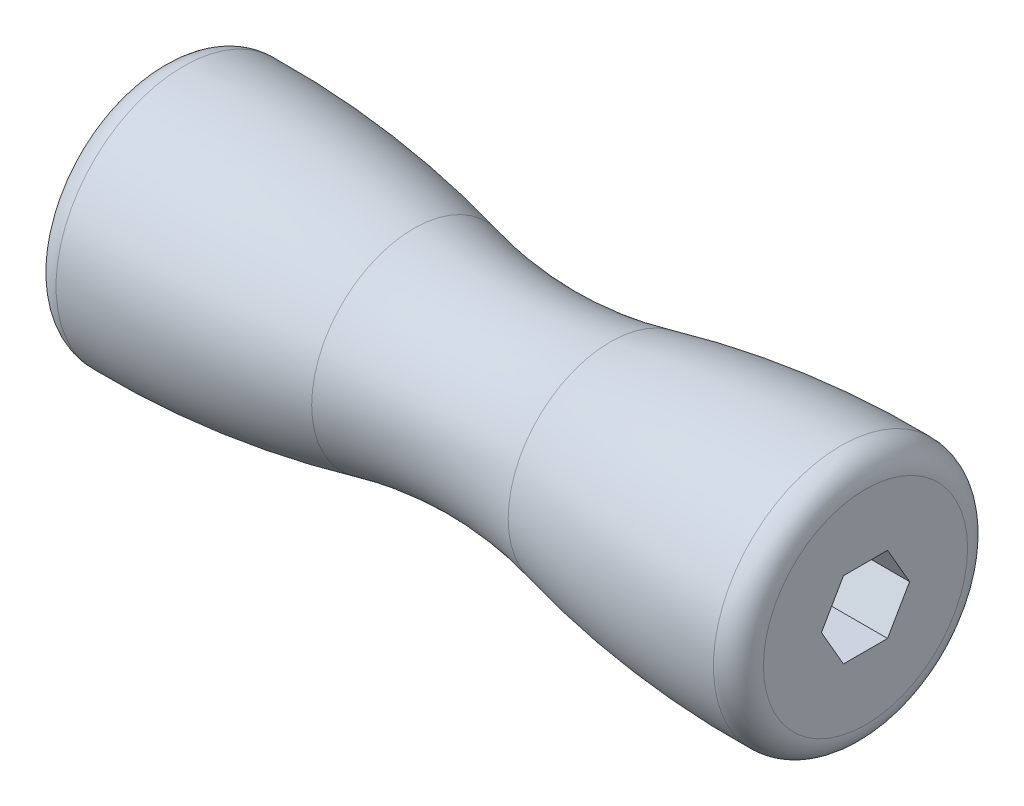
ISO-10303-21;
HEADER;
FILE_DESCRIPTION(('STEP AP214'),'2;1');
FILE_NAME('part.step','',(''),(''),'','','');
FILE_SCHEMA(('AUTOMOTIVE_DESIGN { 1 0 10303 214 1 1 1 1 }'));
ENDSEC;
DATA;
#1=APPLICATION_CONTEXT('core data for automotive mechanical design processes');
#2=APPLICATION_PROTOCOL_DEFINITION('international standard','automotive_design',2000,#1);
#3=PRODUCT_CONTEXT('',#1,'mechanical');
#4=PRODUCT('Part','Part','',(#3));
#5=PRODUCT_RELATED_PRODUCT_CATEGORY('part','',(#4));
#6=PRODUCT_DEFINITION_FORMATION('','',#4);
#7=PRODUCT_DEFINITION_CONTEXT('part definition',#1,'design');
#8=PRODUCT_DEFINITION('design','',#6,#7);
#9=PRODUCT_DEFINITION_SHAPE('','',#8);
#10=(LENGTH_UNIT() NAMED_UNIT(*) SI_UNIT(.MILLI.,.METRE.));
#11=(NAMED_UNIT(*) PLANE_ANGLE_UNIT() SI_UNIT($,.RADIAN.));
#12=(NAMED_UNIT(*) SI_UNIT($,.STERADIAN.) SOLID_ANGLE_UNIT());
#13=UNCERTAINTY_MEASURE_WITH_UNIT(LENGTH_MEASURE(1.E-05),#10,'distance_accuracy_value','');
#14=(GEOMETRIC_REPRESENTATION_CONTEXT(3) GLOBAL_UNCERTAINTY_ASSIGNED_CONTEXT((#13)) GLOBAL_UNIT_ASSIGNED_CONTEXT((#10,
#11,#12)) REPRESENTATION_CONTEXT('',''));
#15=CARTESIAN_POINT('',(0.,0.,0.));
#16=DIRECTION('',(0.,0.,1.));
#17=DIRECTION('',(1.,0.,0.));
#18=AXIS2_PLACEMENT_3D('',#15,#16,#17);
#19=CARTESIAN_POINT('',(-25.,0.,0.));
#20=DIRECTION('',(-1.,0.,0.));
#21=DIRECTION('',(0.,-1.,0.));
#22=AXIS2_PLACEMENT_3D('',#19,#20,#21);
#23=PLANE('',#22);
#24=DIRECTION('',(0.,0.866025403784439,-0.5));
#25=VECTOR('',#24,1.);
#26=CARTESIAN_POINT('',(-25.,-2.7,-1.55884572681199));
#27=LINE('',#26,#25);
#28=CARTESIAN_POINT('',(-25.,-2.7,-1.55884572681199));
#29=VERTEX_POINT('',#28);
#30=CARTESIAN_POINT('',(-25.,0.,-3.11769145362398));
#31=VERTEX_POINT('',#30);
#32=EDGE_CURVE('E91',#29,#31,#27,.T.);
#33=ORIENTED_EDGE('',*,*,#32,.T.);
#34=DIRECTION('',(0.,0.866025403784439,0.5));
#35=VECTOR('',#34,1.);
#36=CARTESIAN_POINT('',(-25.,0.,-3.11769145362398));
#37=LINE('',#36,#35);
#38=CARTESIAN_POINT('',(-25.,2.7,-1.55884572681199));
#39=VERTEX_POINT('',#38);
#40=EDGE_CURVE('E100',#31,#39,#37,.T.);
#41=ORIENTED_EDGE('',*,*,#40,.T.);
#42=DIRECTION('',(0.,0.,1.));
#43=VECTOR('',#42,1.);
#44=CARTESIAN_POINT('',(-25.,2.7,-1.55884572681199));
#45=LINE('',#44,#43);
#46=CARTESIAN_POINT('',(-25.,2.7,1.55884572681199));
#47=VERTEX_POINT('',#46);
#48=EDGE_CURVE('E51',#39,#47,#45,.T.);
#49=ORIENTED_EDGE('',*,*,#48,.T.);
#50=DIRECTION('',(0.,-0.866025403784439,0.5));
#51=VECTOR('',#50,1.);
#52=CARTESIAN_POINT('',(-25.,2.7,1.55884572681199));
#53=LINE('',#52,#51);
#54=CARTESIAN_POINT('',(-25.,0.,3.11769145362398));
#55=VERTEX_POINT('',#54);
#56=EDGE_CURVE('E114',#47,#55,#53,.T.);
#57=ORIENTED_EDGE('',*,*,#56,.T.);
#58=DIRECTION('',(0.,-0.866025403784438,-0.5));
#59=VECTOR('',#58,1.);
#60=CARTESIAN_POINT('',(-25.,0.,3.11769145362398));
#61=LINE('',#60,#59);
#62=CARTESIAN_POINT('',(-25.,-2.7,1.55884572681199));
#63=VERTEX_POINT('',#62);
#64=EDGE_CURVE('E117',#55,#63,#61,.T.);
#65=ORIENTED_EDGE('',*,*,#64,.T.);
#66=DIRECTION('',(0.,0.,-1.));
#67=VECTOR('',#66,1.);
#68=CARTESIAN_POINT('',(-25.,-2.7,1.55884572681199));
#69=LINE('',#68,#67);
#70=EDGE_CURVE('E97',#63,#29,#69,.T.);
#71=ORIENTED_EDGE('',*,*,#70,.T.);
#72=EDGE_LOOP('',(#33,#41,#49,#57,#65,#71));
#73=FACE_BOUND('',#72,.T.);
#74=CARTESIAN_POINT('',(-25.,0.,0.));
#75=DIRECTION('',(1.,0.,0.));
#76=DIRECTION('',(0.,1.,0.));
#77=AXIS2_PLACEMENT_3D('',#74,#75,#76);
#78=CIRCLE('',#77,7.21812745520262);
#79=CARTESIAN_POINT('',(-25.,7.21812745520262,0.));
#80=VERTEX_POINT('',#79);
#81=EDGE_CURVE('E11',#80,#80,#78,.T.);
#82=ORIENTED_EDGE('',*,*,#81,.F.);
#83=EDGE_LOOP('',(#82));
#84=FACE_BOUND('',#83,.T.);
#85=ADVANCED_FACE('F37',(#73,#84),#23,.T.);
#86=CARTESIAN_POINT('',(-23.217947805922,0.,0.));
#87=DIRECTION('',(1.,0.,0.));
#88=DIRECTION('',(0.,1.,0.));
#89=AXIS2_PLACEMENT_3D('',#86,#87,#88);
#90=TOROIDAL_SURFACE('',#89,7.21812745520262,1.782052194078);
#91=ORIENTED_EDGE('',*,*,#81,.T.);
#92=EDGE_LOOP('',(#91));
#93=FACE_BOUND('',#92,.T.);
#94=CARTESIAN_POINT('',(-23.2432510965285,0.,0.));
#95=DIRECTION('',(1.,0.,0.));
#96=DIRECTION('',(0.,1.,0.));
#97=AXIS2_PLACEMENT_3D('',#94,#95,#96);
#98=CIRCLE('',#97,9.);
#99=CARTESIAN_POINT('',(-23.2432510965285,9.,0.));
#100=VERTEX_POINT('',#99);
#101=EDGE_CURVE('E44',#100,#100,#98,.T.);
#102=ORIENTED_EDGE('',*,*,#101,.F.);
#103=EDGE_LOOP('',(#102));
#104=FACE_BOUND('',#103,.T.);
#105=ADVANCED_FACE('F157',(#93,#104),#90,.T.);
#106=CARTESIAN_POINT('',(-22.2956280625294,0.,0.));
#107=DIRECTION('',(1.,0.,0.));
#108=DIRECTION('',(0.,1.,0.));
#109=AXIS2_PLACEMENT_3D('',#106,#107,#108);
#110=DEGENERATE_TOROIDAL_SURFACE('',#109,57.7321690826381,66.7388970532805,.F.);
#111=ORIENTED_EDGE('',*,*,#101,.T.);
#112=EDGE_LOOP('',(#111));
#113=FACE_BOUND('',#112,.T.);
#114=CARTESIAN_POINT('',(-6.94833645993958,0.,0.));
#115=DIRECTION('',(1.,0.,0.));
#116=DIRECTION('',(0.,1.,0.));
#117=AXIS2_PLACEMENT_3D('',#114,#115,#116);
#118=CIRCLE('',#117,7.21812745520262);
#119=CARTESIAN_POINT('',(-6.94833645993958,7.21812745520262,0.));
#120=VERTEX_POINT('',#119);
#121=EDGE_CURVE('E149',#120,#120,#118,.T.);
#122=ORIENTED_EDGE('',*,*,#121,.F.);
#123=EDGE_LOOP('',(#122));
#124=FACE_BOUND('',#123,.T.);
#125=ADVANCED_FACE('F154',(#113,#124),#110,.F.);
#126=CARTESIAN_POINT('',(0.,0.,0.));
#127=DIRECTION('',(1.,0.,0.));
#128=DIRECTION('',(0.,1.,0.));
#129=AXIS2_PLACEMENT_3D('',#126,#127,#128);
#130=TOROIDAL_SURFACE('',#129,36.6237401980803,30.2153841667555);
#131=ORIENTED_EDGE('',*,*,#121,.T.);
#132=EDGE_LOOP('',(#131));
#133=FACE_BOUND('',#132,.T.);
#134=CARTESIAN_POINT('',(6.94833645993956,0.,0.));
#135=DIRECTION('',(1.,0.,0.));
#136=DIRECTION('',(0.,1.,0.));
#137=AXIS2_PLACEMENT_3D('',#134,#135,#136);
#138=CIRCLE('',#137,7.21812745520262);
#139=CARTESIAN_POINT('',(6.94833645993956,7.21812745520262,0.));
#140=VERTEX_POINT('',#139);
#141=EDGE_CURVE('E146',#140,#140,#138,.T.);
#142=ORIENTED_EDGE('',*,*,#141,.F.);
#143=EDGE_LOOP('',(#142));
#144=FACE_BOUND('',#143,.T.);
#145=ADVANCED_FACE('F164',(#133,#144),#130,.F.);
#146=CARTESIAN_POINT('',(22.2956280625294,0.,0.));
#147=DIRECTION('',(1.,0.,0.));
#148=DIRECTION('',(0.,1.,0.));
#149=AXIS2_PLACEMENT_3D('',#146,#147,#148);
#150=DEGENERATE_TOROIDAL_SURFACE('',#149,57.7321690826381,66.7388970532805,.F.);
#151=ORIENTED_EDGE('',*,*,#141,.T.);
#152=EDGE_LOOP('',(#151));
#153=FACE_BOUND('',#152,.T.);
#154=CARTESIAN_POINT('',(23.2432510965285,0.,0.));
#155=DIRECTION('',(1.,0.,0.));
#156=DIRECTION('',(0.,1.,0.));
#157=AXIS2_PLACEMENT_3D('',#154,#155,#156);
#158=CIRCLE('',#157,9.);
#159=CARTESIAN_POINT('',(23.2432510965285,9.,0.));
#160=VERTEX_POINT('',#159);
#161=EDGE_CURVE('E143',#160,#160,#158,.T.);
#162=ORIENTED_EDGE('',*,*,#161,.F.);
#163=EDGE_LOOP('',(#162));
#164=FACE_BOUND('',#163,.T.);
#165=ADVANCED_FACE('F169',(#153,#164),#150,.F.);
#166=CARTESIAN_POINT('',(23.217947805922,0.,0.));
#167=DIRECTION('',(1.,0.,0.));
#168=DIRECTION('',(0.,1.,0.));
#169=AXIS2_PLACEMENT_3D('',#166,#167,#168);
#170=TOROIDAL_SURFACE('',#169,7.21812745520262,1.782052194078);
#171=ORIENTED_EDGE('',*,*,#161,.T.);
#172=EDGE_LOOP('',(#171));
#173=FACE_BOUND('',#172,.T.);
#174=CARTESIAN_POINT('',(25.,0.,0.));
#175=DIRECTION('',(1.,0.,0.));
#176=DIRECTION('',(0.,1.,0.));
#177=AXIS2_PLACEMENT_3D('',#174,#175,#176);
#178=CIRCLE('',#177,7.21812745520262);
#179=CARTESIAN_POINT('',(25.,7.21812745520262,0.));
#180=VERTEX_POINT('',#179);
#181=EDGE_CURVE('E133',#180,#180,#178,.T.);
#182=ORIENTED_EDGE('',*,*,#181,.F.);
#183=EDGE_LOOP('',(#182));
#184=FACE_BOUND('',#183,.T.);
#185=ADVANCED_FACE('F173',(#173,#184),#170,.T.);
#186=CARTESIAN_POINT('',(25.,7.21812745520262,0.));
#187=DIRECTION('',(1.,0.,0.));
#188=DIRECTION('',(0.,1.,0.));
#189=AXIS2_PLACEMENT_3D('',#186,#187,#188);
#190=PLANE('',#189);
#191=DIRECTION('',(0.,0.866025403784439,-0.5));
#192=VECTOR('',#191,1.);
#193=CARTESIAN_POINT('',(25.,-2.7,-1.55884572681199));
#194=LINE('',#193,#192);
#195=CARTESIAN_POINT('',(25.,-2.7,-1.55884572681199));
#196=VERTEX_POINT('',#195);
#197=CARTESIAN_POINT('',(25.,0.,-3.11769145362398));
#198=VERTEX_POINT('',#197);
#199=EDGE_CURVE('E59',#196,#198,#194,.T.);
#200=ORIENTED_EDGE('',*,*,#199,.F.);
#201=DIRECTION('',(0.,0.,-1.));
#202=VECTOR('',#201,1.);
#203=CARTESIAN_POINT('',(25.,-2.7,1.55884572681199));
#204=LINE('',#203,#202);
#205=CARTESIAN_POINT('',(25.,-2.7,1.55884572681199));
#206=VERTEX_POINT('',#205);
#207=EDGE_CURVE('E107',#206,#196,#204,.T.);
#208=ORIENTED_EDGE('',*,*,#207,.F.);
#209=DIRECTION('',(0.,-0.866025403784438,-0.5));
#210=VECTOR('',#209,1.);
#211=CARTESIAN_POINT('',(25.,0.,3.11769145362398));
#212=LINE('',#211,#210);
#213=CARTESIAN_POINT('',(25.,0.,3.11769145362398));
#214=VERTEX_POINT('',#213);
#215=EDGE_CURVE('E110',#214,#206,#212,.T.);
#216=ORIENTED_EDGE('',*,*,#215,.F.);
#217=DIRECTION('',(0.,-0.866025403784439,0.5));
#218=VECTOR('',#217,1.);
#219=CARTESIAN_POINT('',(25.,2.7,1.55884572681199));
#220=LINE('',#219,#218);
#221=CARTESIAN_POINT('',(25.,2.7,1.55884572681199));
#222=VERTEX_POINT('',#221);
#223=EDGE_CURVE('E126',#222,#214,#220,.T.);
#224=ORIENTED_EDGE('',*,*,#223,.F.);
#225=DIRECTION('',(0.,0.,1.));
#226=VECTOR('',#225,1.);
#227=CARTESIAN_POINT('',(25.,2.7,-1.55884572681199));
#228=LINE('',#227,#226);
#229=CARTESIAN_POINT('',(25.,2.7,-1.55884572681199));
#230=VERTEX_POINT('',#229);
#231=EDGE_CURVE('E123',#230,#222,#228,.T.);
#232=ORIENTED_EDGE('',*,*,#231,.F.);
#233=DIRECTION('',(0.,0.866025403784439,0.5));
#234=VECTOR('',#233,1.);
#235=CARTESIAN_POINT('',(25.,0.,-3.11769145362398));
#236=LINE('',#235,#234);
#237=EDGE_CURVE('E121',#198,#230,#236,.T.);
#238=ORIENTED_EDGE('',*,*,#237,.F.);
#239=EDGE_LOOP('',(#200,#208,#216,#224,#232,#238));
#240=FACE_BOUND('',#239,.T.);
#241=ORIENTED_EDGE('',*,*,#181,.T.);
#242=EDGE_LOOP('',(#241));
#243=FACE_BOUND('',#242,.T.);
#244=ADVANCED_FACE('F177',(#240,#243),#190,.T.);
#245=CARTESIAN_POINT('',(-25.,-2.7,-1.55884572681199));
#246=DIRECTION('',(0.,-0.5,-0.866025403784439));
#247=DIRECTION('',(0.,0.866025403784439,-0.5));
#248=AXIS2_PLACEMENT_3D('',#245,#246,#247);
#249=PLANE('',#248);
#250=ORIENTED_EDGE('',*,*,#199,.T.);
#251=DIRECTION('',(1.,0.,0.));
#252=VECTOR('',#251,1.);
#253=CARTESIAN_POINT('',(-25.,0.,-3.11769145362398));
#254=LINE('',#253,#252);
#255=EDGE_CURVE('E87',#31,#198,#254,.T.);
#256=ORIENTED_EDGE('',*,*,#255,.F.);
#257=ORIENTED_EDGE('',*,*,#32,.F.);
#258=DIRECTION('',(1.,0.,0.));
#259=VECTOR('',#258,1.);
#260=CARTESIAN_POINT('',(-25.,-2.7,-1.55884572681199));
#261=LINE('',#260,#259);
#262=EDGE_CURVE('E131',#29,#196,#261,.T.);
#263=ORIENTED_EDGE('',*,*,#262,.T.);
#264=EDGE_LOOP('',(#250,#256,#257,#263));
#265=FACE_BOUND('',#264,.T.);
#266=ADVANCED_FACE('F89',(#265),#249,.F.);
#267=CARTESIAN_POINT('',(-25.,-2.7,1.55884572681199));
#268=DIRECTION('',(0.,-1.,0.));
#269=DIRECTION('',(1.,0.,0.));
#270=AXIS2_PLACEMENT_3D('',#267,#268,#269);
#271=PLANE('',#270);
#272=ORIENTED_EDGE('',*,*,#207,.T.);
#273=ORIENTED_EDGE('',*,*,#262,.F.);
#274=ORIENTED_EDGE('',*,*,#70,.F.);
#275=DIRECTION('',(1.,0.,0.));
#276=VECTOR('',#275,1.);
#277=CARTESIAN_POINT('',(-25.,-2.7,1.55884572681199));
#278=LINE('',#277,#276);
#279=EDGE_CURVE('E134',#63,#206,#278,.T.);
#280=ORIENTED_EDGE('',*,*,#279,.T.);
#281=EDGE_LOOP('',(#272,#273,#274,#280));
#282=FACE_BOUND('',#281,.T.);
#283=ADVANCED_FACE('F184',(#282),#271,.F.);
#284=CARTESIAN_POINT('',(-25.,0.,3.11769145362398));
#285=DIRECTION('',(0.,-0.5,0.866025403784439));
#286=DIRECTION('',(0.,-0.866025403784439,-0.5));
#287=AXIS2_PLACEMENT_3D('',#284,#285,#286);
#288=PLANE('',#287);
#289=ORIENTED_EDGE('',*,*,#215,.T.);
#290=ORIENTED_EDGE('',*,*,#279,.F.);
#291=ORIENTED_EDGE('',*,*,#64,.F.);
#292=DIRECTION('',(1.,0.,0.));
#293=VECTOR('',#292,1.);
#294=CARTESIAN_POINT('',(-25.,0.,3.11769145362398));
#295=LINE('',#294,#293);
#296=EDGE_CURVE('E136',#55,#214,#295,.T.);
#297=ORIENTED_EDGE('',*,*,#296,.T.);
#298=EDGE_LOOP('',(#289,#290,#291,#297));
#299=FACE_BOUND('',#298,.T.);
#300=ADVANCED_FACE('F193',(#299),#288,.F.);
#301=CARTESIAN_POINT('',(-25.,2.7,1.55884572681199));
#302=DIRECTION('',(0.,0.5,0.866025403784439));
#303=DIRECTION('',(0.,-0.866025403784439,0.5));
#304=AXIS2_PLACEMENT_3D('',#301,#302,#303);
#305=PLANE('',#304);
#306=ORIENTED_EDGE('',*,*,#223,.T.);
#307=ORIENTED_EDGE('',*,*,#296,.F.);
#308=ORIENTED_EDGE('',*,*,#56,.F.);
#309=DIRECTION('',(1.,0.,0.));
#310=VECTOR('',#309,1.);
#311=CARTESIAN_POINT('',(-25.,2.7,1.55884572681199));
#312=LINE('',#311,#310);
#313=EDGE_CURVE('E138',#47,#222,#312,.T.);
#314=ORIENTED_EDGE('',*,*,#313,.T.);
#315=EDGE_LOOP('',(#306,#307,#308,#314));
#316=FACE_BOUND('',#315,.T.);
#317=ADVANCED_FACE('F190',(#316),#305,.F.);
#318=CARTESIAN_POINT('',(-25.,2.7,-1.55884572681199));
#319=DIRECTION('',(0.,1.,0.));
#320=DIRECTION('',(-1.,0.,0.));
#321=AXIS2_PLACEMENT_3D('',#318,#319,#320);
#322=PLANE('',#321);
#323=ORIENTED_EDGE('',*,*,#231,.T.);
#324=ORIENTED_EDGE('',*,*,#313,.F.);
#325=ORIENTED_EDGE('',*,*,#48,.F.);
#326=DIRECTION('',(1.,0.,0.));
#327=VECTOR('',#326,1.);
#328=CARTESIAN_POINT('',(-25.,2.7,-1.55884572681199));
#329=LINE('',#328,#327);
#330=EDGE_CURVE('E96',#39,#230,#329,.T.);
#331=ORIENTED_EDGE('',*,*,#330,.T.);
#332=EDGE_LOOP('',(#323,#324,#325,#331));
#333=FACE_BOUND('',#332,.T.);
#334=ADVANCED_FACE('F187',(#333),#322,.F.);
#335=CARTESIAN_POINT('',(-25.,0.,-3.11769145362398));
#336=DIRECTION('',(0.,0.5,-0.866025403784438));
#337=DIRECTION('',(0.,0.866025403784439,0.5));
#338=AXIS2_PLACEMENT_3D('',#335,#336,#337);
#339=PLANE('',#338);
#340=ORIENTED_EDGE('',*,*,#237,.T.);
#341=ORIENTED_EDGE('',*,*,#330,.F.);
#342=ORIENTED_EDGE('',*,*,#40,.F.);
#343=ORIENTED_EDGE('',*,*,#255,.T.);
#344=EDGE_LOOP('',(#340,#341,#342,#343));
#345=FACE_BOUND('',#344,.T.);
#346=ADVANCED_FACE('F101',(#345),#339,.F.);
#347=CLOSED_SHELL('',(#85,#105,#125,#145,#165,#185,#244,#266,#283,#300,#317,#334,#346));
#348=MANIFOLD_SOLID_BREP('B2',#347);
#349=ADVANCED_BREP_SHAPE_REPRESENTATION('',(#18,#348),#14);
#350=SHAPE_DEFINITION_REPRESENTATION(#9,#349);
ENDSEC;
END-ISO-10303-21;
